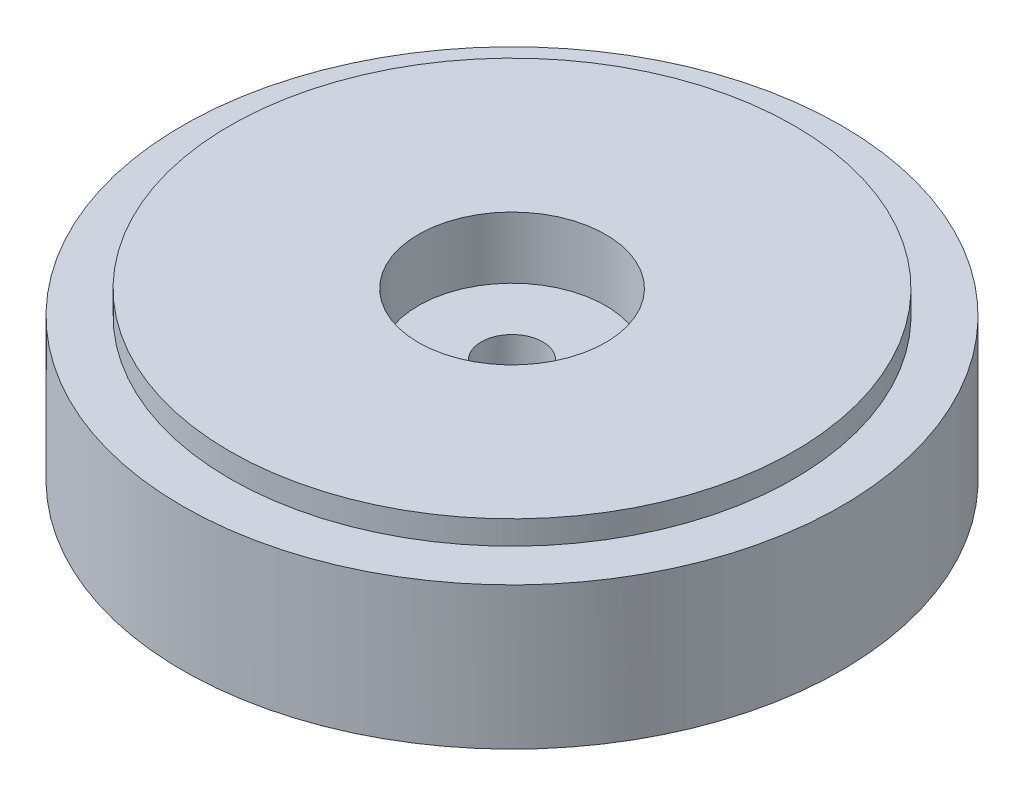
ISO-10303-21;
HEADER;
FILE_DESCRIPTION(('STEP AP214'),'2;1');
FILE_NAME('part.step','',(''),(''),'','','');
FILE_SCHEMA(('AUTOMOTIVE_DESIGN { 1 0 10303 214 1 1 1 1 }'));
ENDSEC;
DATA;
#1=APPLICATION_CONTEXT('core data for automotive mechanical design processes');
#2=APPLICATION_PROTOCOL_DEFINITION('international standard','automotive_design',2000,#1);
#3=PRODUCT_CONTEXT('',#1,'mechanical');
#4=PRODUCT('Part','Part','',(#3));
#5=PRODUCT_RELATED_PRODUCT_CATEGORY('part','',(#4));
#6=PRODUCT_DEFINITION_FORMATION('','',#4);
#7=PRODUCT_DEFINITION_CONTEXT('part definition',#1,'design');
#8=PRODUCT_DEFINITION('design','',#6,#7);
#9=PRODUCT_DEFINITION_SHAPE('','',#8);
#10=(LENGTH_UNIT() NAMED_UNIT(*) SI_UNIT(.MILLI.,.METRE.));
#11=(NAMED_UNIT(*) PLANE_ANGLE_UNIT() SI_UNIT($,.RADIAN.));
#12=(NAMED_UNIT(*) SI_UNIT($,.STERADIAN.) SOLID_ANGLE_UNIT());
#13=UNCERTAINTY_MEASURE_WITH_UNIT(LENGTH_MEASURE(1.E-05),#10,'distance_accuracy_value','');
#14=(GEOMETRIC_REPRESENTATION_CONTEXT(3) GLOBAL_UNCERTAINTY_ASSIGNED_CONTEXT((#13)) GLOBAL_UNIT_ASSIGNED_CONTEXT((#10,
#11,#12)) REPRESENTATION_CONTEXT('',''));
#15=CARTESIAN_POINT('',(0.,0.,0.));
#16=DIRECTION('',(0.,0.,1.));
#17=DIRECTION('',(1.,0.,0.));
#18=AXIS2_PLACEMENT_3D('',#15,#16,#17);
#19=CARTESIAN_POINT('',(0.,40.,0.));
#20=DIRECTION('',(0.,-1.,0.));
#21=DIRECTION('',(0.,0.,-1.));
#22=AXIS2_PLACEMENT_3D('',#19,#20,#21);
#23=CYLINDRICAL_SURFACE('',#22,69.5);
#24=CARTESIAN_POINT('',(0.,35.,0.));
#25=DIRECTION('',(0.,1.,0.));
#26=DIRECTION('',(0.,0.,1.));
#27=AXIS2_PLACEMENT_3D('',#24,#25,#26);
#28=CIRCLE('',#27,69.5);
#29=CARTESIAN_POINT('',(0.,35.,69.5));
#30=VERTEX_POINT('',#29);
#31=EDGE_CURVE('E46',#30,#30,#28,.T.);
#32=ORIENTED_EDGE('',*,*,#31,.F.);
#33=EDGE_LOOP('',(#32));
#34=FACE_BOUND('',#33,.T.);
#35=CARTESIAN_POINT('',(0.,5.,0.));
#36=DIRECTION('',(0.,-1.,0.));
#37=DIRECTION('',(0.,0.,-1.));
#38=AXIS2_PLACEMENT_3D('',#35,#36,#37);
#39=CIRCLE('',#38,69.5);
#40=CARTESIAN_POINT('',(0.,5.,-69.5));
#41=VERTEX_POINT('',#40);
#42=EDGE_CURVE('E69',#41,#41,#39,.T.);
#43=ORIENTED_EDGE('',*,*,#42,.F.);
#44=EDGE_LOOP('',(#43));
#45=FACE_BOUND('',#44,.T.);
#46=ADVANCED_FACE('F43',(#34,#45),#23,.T.);
#47=CARTESIAN_POINT('',(0.,35.,0.));
#48=DIRECTION('',(0.,1.,0.));
#49=DIRECTION('',(0.,0.,1.));
#50=AXIS2_PLACEMENT_3D('',#47,#48,#49);
#51=PLANE('',#50);
#52=CARTESIAN_POINT('',(0.,35.,0.));
#53=DIRECTION('',(0.,1.,0.));
#54=DIRECTION('',(0.,0.,1.));
#55=AXIS2_PLACEMENT_3D('',#52,#53,#54);
#56=CIRCLE('',#55,59.5);
#57=CARTESIAN_POINT('',(0.,35.,59.5));
#58=VERTEX_POINT('',#57);
#59=EDGE_CURVE('E54',#58,#58,#56,.T.);
#60=ORIENTED_EDGE('',*,*,#59,.F.);
#61=EDGE_LOOP('',(#60));
#62=FACE_BOUND('',#61,.T.);
#63=ORIENTED_EDGE('',*,*,#31,.T.);
#64=EDGE_LOOP('',(#63));
#65=FACE_BOUND('',#64,.T.);
#66=ADVANCED_FACE('F83',(#62,#65),#51,.T.);
#67=CARTESIAN_POINT('',(0.,35.,0.));
#68=DIRECTION('',(0.,1.,0.));
#69=DIRECTION('',(0.,0.,1.));
#70=AXIS2_PLACEMENT_3D('',#67,#68,#69);
#71=CYLINDRICAL_SURFACE('',#70,59.5);
#72=ORIENTED_EDGE('',*,*,#59,.T.);
#73=EDGE_LOOP('',(#72));
#74=FACE_BOUND('',#73,.T.);
#75=CARTESIAN_POINT('',(0.,40.,0.));
#76=DIRECTION('',(0.,1.,0.));
#77=DIRECTION('',(0.,0.,1.));
#78=AXIS2_PLACEMENT_3D('',#75,#76,#77);
#79=CIRCLE('',#78,59.5);
#80=CARTESIAN_POINT('',(0.,40.,59.5));
#81=VERTEX_POINT('',#80);
#82=EDGE_CURVE('E74',#81,#81,#79,.T.);
#83=ORIENTED_EDGE('',*,*,#82,.F.);
#84=EDGE_LOOP('',(#83));
#85=FACE_BOUND('',#84,.T.);
#86=ADVANCED_FACE('F81',(#74,#85),#71,.T.);
#87=CARTESIAN_POINT('',(0.,40.,0.));
#88=DIRECTION('',(0.,1.,0.));
#89=DIRECTION('',(0.,0.,1.));
#90=AXIS2_PLACEMENT_3D('',#87,#88,#89);
#91=PLANE('',#90);
#92=CARTESIAN_POINT('',(0.,40.,0.));
#93=DIRECTION('',(0.,1.,0.));
#94=DIRECTION('',(0.,0.,1.));
#95=AXIS2_PLACEMENT_3D('',#92,#93,#94);
#96=CIRCLE('',#95,19.75);
#97=CARTESIAN_POINT('',(0.,40.,19.75));
#98=VERTEX_POINT('',#97);
#99=EDGE_CURVE('E63',#98,#98,#96,.T.);
#100=ORIENTED_EDGE('',*,*,#99,.F.);
#101=EDGE_LOOP('',(#100));
#102=FACE_BOUND('',#101,.T.);
#103=ORIENTED_EDGE('',*,*,#82,.T.);
#104=EDGE_LOOP('',(#103));
#105=FACE_BOUND('',#104,.T.);
#106=ADVANCED_FACE('F79',(#102,#105),#91,.T.);
#107=CARTESIAN_POINT('',(0.,5.,0.));
#108=DIRECTION('',(0.,-1.,0.));
#109=DIRECTION('',(0.,0.,-1.));
#110=AXIS2_PLACEMENT_3D('',#107,#108,#109);
#111=PLANE('',#110);
#112=CARTESIAN_POINT('',(0.,5.,0.));
#113=DIRECTION('',(0.,-1.,0.));
#114=DIRECTION('',(0.,0.,-1.));
#115=AXIS2_PLACEMENT_3D('',#112,#113,#114);
#116=CIRCLE('',#115,59.5);
#117=CARTESIAN_POINT('',(0.,5.,-59.5));
#118=VERTEX_POINT('',#117);
#119=EDGE_CURVE('E66',#118,#118,#116,.T.);
#120=ORIENTED_EDGE('',*,*,#119,.F.);
#121=EDGE_LOOP('',(#120));
#122=FACE_BOUND('',#121,.T.);
#123=ORIENTED_EDGE('',*,*,#42,.T.);
#124=EDGE_LOOP('',(#123));
#125=FACE_BOUND('',#124,.T.);
#126=ADVANCED_FACE('F90',(#122,#125),#111,.T.);
#127=CARTESIAN_POINT('',(0.,5.,0.));
#128=DIRECTION('',(0.,-1.,0.));
#129=DIRECTION('',(0.,0.,-1.));
#130=AXIS2_PLACEMENT_3D('',#127,#128,#129);
#131=CYLINDRICAL_SURFACE('',#130,59.5);
#132=ORIENTED_EDGE('',*,*,#119,.T.);
#133=EDGE_LOOP('',(#132));
#134=FACE_BOUND('',#133,.T.);
#135=CARTESIAN_POINT('',(0.,0.,0.));
#136=DIRECTION('',(0.,-1.,0.));
#137=DIRECTION('',(0.,0.,-1.));
#138=AXIS2_PLACEMENT_3D('',#135,#136,#137);
#139=CIRCLE('',#138,59.5);
#140=CARTESIAN_POINT('',(0.,0.,-59.5));
#141=VERTEX_POINT('',#140);
#142=EDGE_CURVE('E62',#141,#141,#139,.T.);
#143=ORIENTED_EDGE('',*,*,#142,.F.);
#144=EDGE_LOOP('',(#143));
#145=FACE_BOUND('',#144,.T.);
#146=ADVANCED_FACE('F105',(#134,#145),#131,.T.);
#147=CARTESIAN_POINT('',(0.,0.,0.));
#148=DIRECTION('',(0.,1.,0.));
#149=DIRECTION('',(0.,0.,1.));
#150=AXIS2_PLACEMENT_3D('',#147,#148,#149);
#151=PLANE('',#150);
#152=CARTESIAN_POINT('',(0.,0.,0.));
#153=DIRECTION('',(0.,-1.,0.));
#154=DIRECTION('',(0.,0.,-1.));
#155=AXIS2_PLACEMENT_3D('',#152,#153,#154);
#156=CIRCLE('',#155,17.);
#157=CARTESIAN_POINT('',(0.,0.,-17.));
#158=VERTEX_POINT('',#157);
#159=EDGE_CURVE('E11',#158,#158,#156,.T.);
#160=ORIENTED_EDGE('',*,*,#159,.F.);
#161=EDGE_LOOP('',(#160));
#162=FACE_BOUND('',#161,.T.);
#163=ORIENTED_EDGE('',*,*,#142,.T.);
#164=EDGE_LOOP('',(#163));
#165=FACE_BOUND('',#164,.T.);
#166=ADVANCED_FACE('F110',(#162,#165),#151,.F.);
#167=CARTESIAN_POINT('',(0.,27.,0.));
#168=DIRECTION('',(0.,1.,0.));
#169=DIRECTION('',(0.,0.,1.));
#170=AXIS2_PLACEMENT_3D('',#167,#168,#169);
#171=CYLINDRICAL_SURFACE('',#170,19.75);
#172=CARTESIAN_POINT('',(0.,27.,0.));
#173=DIRECTION('',(0.,1.,0.));
#174=DIRECTION('',(0.,0.,1.));
#175=AXIS2_PLACEMENT_3D('',#172,#173,#174);
#176=CIRCLE('',#175,19.75);
#177=CARTESIAN_POINT('',(0.,27.,19.75));
#178=VERTEX_POINT('',#177);
#179=EDGE_CURVE('E59',#178,#178,#176,.T.);
#180=CARTESIAN_POINT('',(0.,27.,19.75));
#181=CARTESIAN_POINT('',(0.,27.1354166666667,19.75));
#182=CARTESIAN_POINT('',(0.,27.2708333333333,19.75));
#183=CARTESIAN_POINT('',(0.,27.5416666666667,19.75));
#184=CARTESIAN_POINT('',(0.,27.6770833333333,19.75));
#185=CARTESIAN_POINT('',(0.,27.9479166666667,19.75));
#186=CARTESIAN_POINT('',(0.,28.0833333333333,19.75));
#187=CARTESIAN_POINT('',(0.,28.3541666666667,19.75));
#188=CARTESIAN_POINT('',(0.,28.4895833333333,19.75));
#189=CARTESIAN_POINT('',(0.,28.7604166666667,19.75));
#190=CARTESIAN_POINT('',(0.,28.8958333333333,19.75));
#191=CARTESIAN_POINT('',(0.,29.1666666666667,19.75));
#192=CARTESIAN_POINT('',(0.,29.3020833333333,19.75));
#193=CARTESIAN_POINT('',(0.,29.5729166666667,19.75));
#194=CARTESIAN_POINT('',(0.,29.7083333333333,19.75));
#195=CARTESIAN_POINT('',(0.,29.9791666666667,19.75));
#196=CARTESIAN_POINT('',(0.,30.1145833333333,19.75));
#197=CARTESIAN_POINT('',(0.,30.3854166666667,19.75));
#198=CARTESIAN_POINT('',(0.,30.5208333333333,19.75));
#199=CARTESIAN_POINT('',(0.,30.7916666666667,19.75));
#200=CARTESIAN_POINT('',(0.,30.9270833333333,19.75));
#201=CARTESIAN_POINT('',(0.,31.1979166666667,19.75));
#202=CARTESIAN_POINT('',(0.,31.3333333333333,19.75));
#203=CARTESIAN_POINT('',(0.,31.6041666666667,19.75));
#204=CARTESIAN_POINT('',(0.,31.7395833333333,19.75));
#205=CARTESIAN_POINT('',(0.,32.0104166666667,19.75));
#206=CARTESIAN_POINT('',(0.,32.1458333333333,19.75));
#207=CARTESIAN_POINT('',(0.,32.4166666666667,19.75));
#208=CARTESIAN_POINT('',(0.,32.5520833333333,19.75));
#209=CARTESIAN_POINT('',(0.,32.8229166666667,19.75));
#210=CARTESIAN_POINT('',(0.,32.9583333333333,19.75));
#211=CARTESIAN_POINT('',(0.,33.2291666666667,19.75));
#212=CARTESIAN_POINT('',(0.,33.3645833333333,19.75));
#213=CARTESIAN_POINT('',(0.,33.6354166666667,19.75));
#214=CARTESIAN_POINT('',(0.,33.7708333333333,19.75));
#215=CARTESIAN_POINT('',(0.,34.0416666666667,19.75));
#216=CARTESIAN_POINT('',(0.,34.1770833333333,19.75));
#217=CARTESIAN_POINT('',(0.,34.4479166666667,19.75));
#218=CARTESIAN_POINT('',(0.,34.5833333333333,19.75));
#219=CARTESIAN_POINT('',(0.,34.8541666666667,19.75));
#220=CARTESIAN_POINT('',(0.,34.9895833333333,19.75));
#221=CARTESIAN_POINT('',(0.,35.2604166666667,19.75));
#222=CARTESIAN_POINT('',(0.,35.3958333333333,19.75));
#223=CARTESIAN_POINT('',(0.,35.6666666666667,19.75));
#224=CARTESIAN_POINT('',(0.,35.8020833333333,19.75));
#225=CARTESIAN_POINT('',(0.,36.0729166666667,19.75));
#226=CARTESIAN_POINT('',(0.,36.2083333333333,19.75));
#227=CARTESIAN_POINT('',(0.,36.4791666666667,19.75));
#228=CARTESIAN_POINT('',(0.,36.6145833333333,19.75));
#229=CARTESIAN_POINT('',(0.,36.8854166666667,19.75));
#230=CARTESIAN_POINT('',(0.,37.0208333333333,19.75));
#231=CARTESIAN_POINT('',(0.,37.2916666666667,19.75));
#232=CARTESIAN_POINT('',(0.,37.4270833333333,19.75));
#233=CARTESIAN_POINT('',(0.,37.6979166666667,19.75));
#234=CARTESIAN_POINT('',(0.,37.8333333333333,19.75));
#235=CARTESIAN_POINT('',(0.,38.1041666666667,19.75));
#236=CARTESIAN_POINT('',(0.,38.2395833333333,19.75));
#237=CARTESIAN_POINT('',(0.,38.5104166666667,19.75));
#238=CARTESIAN_POINT('',(0.,38.6458333333333,19.75));
#239=CARTESIAN_POINT('',(0.,38.9166666666667,19.75));
#240=CARTESIAN_POINT('',(0.,39.0520833333333,19.75));
#241=CARTESIAN_POINT('',(0.,39.3229166666667,19.75));
#242=CARTESIAN_POINT('',(0.,39.4583333333333,19.75));
#243=CARTESIAN_POINT('',(0.,39.7291666666667,19.75));
#244=CARTESIAN_POINT('',(0.,39.8645833333333,19.75));
#245=CARTESIAN_POINT('',(0.,40.,19.75));
#246=B_SPLINE_CURVE_WITH_KNOTS('',3,(#180,#181,#182,#183,#184,#185,#186,#187,#188,#189,#190,
#191,#192,#193,#194,#195,#196,#197,#198,#199,#200,#201,#202,#203,#204,#205,#206,#207,#208,#209,
#210,#211,#212,#213,#214,#215,#216,#217,#218,#219,#220,#221,#222,#223,#224,#225,#226,#227,#228,
#229,#230,#231,#232,#233,#234,#235,#236,#237,#238,#239,#240,#241,#242,#243,#244,#245),
.UNSPECIFIED.,.F.,.F.,(4,2,2,2,2,2,2,2,2,2,2,2,2,2,2,2,2,2,2,2,2,2,2,2,2,2,2,2,2,2,2,2,4),(0.,
0.40625,0.812500000000001,1.21875,1.625,2.03125,2.4375,2.84375,3.25,3.65625,4.0625,4.46875,
4.875,5.28125,5.6875,6.09375,6.5,6.90625,7.3125,7.71875,8.125,8.53125,8.9375,9.34375,9.75,
10.15625,10.5625,10.96875,11.375,11.78125,12.1875,12.59375,13.),.UNSPECIFIED.);
#247=EDGE_CURVE('BSEAM115',#178,#98,#246,.T.);
#248=ORIENTED_EDGE('',*,*,#179,.F.);
#249=ORIENTED_EDGE('',*,*,#99,.T.);
#250=ORIENTED_EDGE('',*,*,#247,.T.);
#251=ORIENTED_EDGE('',*,*,#247,.F.);
#252=EDGE_LOOP('',(#248,#250,#249,#251));
#253=FACE_BOUND('',#252,.T.);
#254=ADVANCED_FACE('F115',(#253),#171,.F.);
#255=CARTESIAN_POINT('',(0.,27.,0.));
#256=DIRECTION('',(0.,1.,0.));
#257=DIRECTION('',(0.,0.,1.));
#258=AXIS2_PLACEMENT_3D('',#255,#256,#257);
#259=PLANE('',#258);
#260=CARTESIAN_POINT('',(0.,27.,0.));
#261=DIRECTION('',(0.,1.,0.));
#262=DIRECTION('',(0.,0.,1.));
#263=AXIS2_PLACEMENT_3D('',#260,#261,#262);
#264=CIRCLE('',#263,6.5);
#265=CARTESIAN_POINT('',(0.,27.,6.5));
#266=VERTEX_POINT('',#265);
#267=EDGE_CURVE('E139',#266,#266,#264,.T.);
#268=ORIENTED_EDGE('',*,*,#267,.F.);
#269=EDGE_LOOP('',(#268));
#270=FACE_BOUND('',#269,.T.);
#271=ORIENTED_EDGE('',*,*,#179,.T.);
#272=EDGE_LOOP('',(#271));
#273=FACE_BOUND('',#272,.T.);
#274=ADVANCED_FACE('F118',(#270,#273),#259,.T.);
#275=CARTESIAN_POINT('',(0.,-8.,0.));
#276=DIRECTION('',(0.,1.,0.));
#277=DIRECTION('',(0.,0.,1.));
#278=AXIS2_PLACEMENT_3D('',#275,#276,#277);
#279=CYLINDRICAL_SURFACE('',#278,17.);
#280=CARTESIAN_POINT('',(0.,-8.,0.));
#281=DIRECTION('',(0.,-1.,0.));
#282=DIRECTION('',(0.,0.,-1.));
#283=AXIS2_PLACEMENT_3D('',#280,#281,#282);
#284=CIRCLE('',#283,17.);
#285=CARTESIAN_POINT('',(0.,-8.,-17.));
#286=VERTEX_POINT('',#285);
#287=EDGE_CURVE('E57',#286,#286,#284,.T.);
#288=ORIENTED_EDGE('',*,*,#287,.F.);
#289=EDGE_LOOP('',(#288));
#290=FACE_BOUND('',#289,.T.);
#291=ORIENTED_EDGE('',*,*,#159,.T.);
#292=EDGE_LOOP('',(#291));
#293=FACE_BOUND('',#292,.T.);
#294=ADVANCED_FACE('F122',(#290,#293),#279,.T.);
#295=CARTESIAN_POINT('',(0.,-8.,0.));
#296=DIRECTION('',(0.,-1.,0.));
#297=DIRECTION('',(0.,0.,-1.));
#298=AXIS2_PLACEMENT_3D('',#295,#296,#297);
#299=PLANE('',#298);
#300=CARTESIAN_POINT('',(0.,-8.,0.));
#301=DIRECTION('',(0.,-1.,0.));
#302=DIRECTION('',(0.,0.,-1.));
#303=AXIS2_PLACEMENT_3D('',#300,#301,#302);
#304=CIRCLE('',#303,6.5);
#305=CARTESIAN_POINT('',(0.,-8.,-6.5));
#306=VERTEX_POINT('',#305);
#307=EDGE_CURVE('E142',#306,#306,#304,.T.);
#308=ORIENTED_EDGE('',*,*,#307,.F.);
#309=EDGE_LOOP('',(#308));
#310=FACE_BOUND('',#309,.T.);
#311=ORIENTED_EDGE('',*,*,#287,.T.);
#312=EDGE_LOOP('',(#311));
#313=FACE_BOUND('',#312,.T.);
#314=ADVANCED_FACE('F126',(#310,#313),#299,.T.);
#315=CARTESIAN_POINT('',(0.,40.,0.));
#316=DIRECTION('',(0.,-1.,0.));
#317=DIRECTION('',(0.,0.,-1.));
#318=AXIS2_PLACEMENT_3D('',#315,#316,#317);
#319=CYLINDRICAL_SURFACE('',#318,6.5);
#320=ORIENTED_EDGE('',*,*,#267,.T.);
#321=EDGE_LOOP('',(#320));
#322=FACE_BOUND('',#321,.T.);
#323=ORIENTED_EDGE('',*,*,#307,.T.);
#324=EDGE_LOOP('',(#323));
#325=FACE_BOUND('',#324,.T.);
#326=ADVANCED_FACE('F130',(#322,#325),#319,.F.);
#327=CLOSED_SHELL('',(#46,#66,#86,#106,#126,#146,#166,#254,#274,#294,#314,#326));
#328=MANIFOLD_SOLID_BREP('B2',#327);
#329=ADVANCED_BREP_SHAPE_REPRESENTATION('',(#18,#328),#14);
#330=SHAPE_DEFINITION_REPRESENTATION(#9,#329);
ENDSEC;
END-ISO-10303-21;
